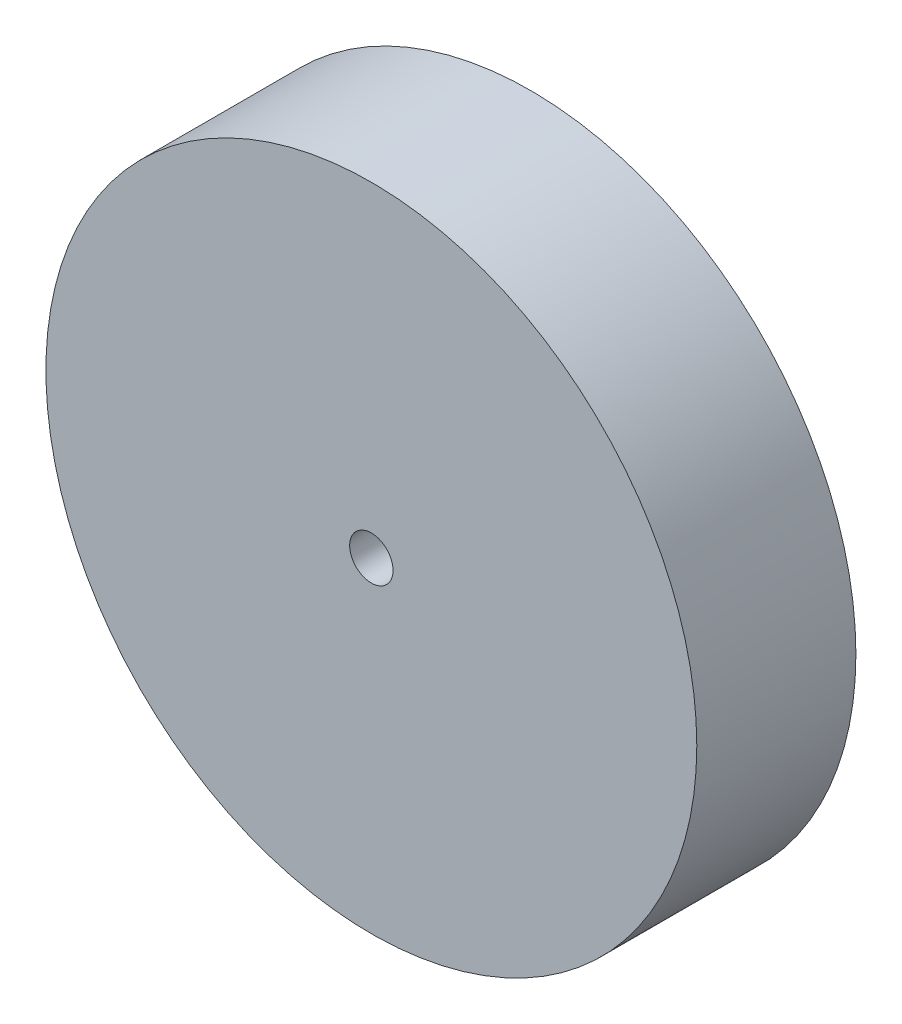
ISO-10303-21;
HEADER;
FILE_DESCRIPTION(('STEP AP214'),'2;1');
FILE_NAME('part.step','',(''),(''),'','','');
FILE_SCHEMA(('AUTOMOTIVE_DESIGN { 1 0 10303 214 1 1 1 1 }'));
ENDSEC;
DATA;
#1=APPLICATION_CONTEXT('core data for automotive mechanical design processes');
#2=APPLICATION_PROTOCOL_DEFINITION('international standard','automotive_design',2000,#1);
#3=PRODUCT_CONTEXT('',#1,'mechanical');
#4=PRODUCT('Part','Part','',(#3));
#5=PRODUCT_RELATED_PRODUCT_CATEGORY('part','',(#4));
#6=PRODUCT_DEFINITION_FORMATION('','',#4);
#7=PRODUCT_DEFINITION_CONTEXT('part definition',#1,'design');
#8=PRODUCT_DEFINITION('design','',#6,#7);
#9=PRODUCT_DEFINITION_SHAPE('','',#8);
#10=(LENGTH_UNIT() NAMED_UNIT(*) SI_UNIT(.MILLI.,.METRE.));
#11=(NAMED_UNIT(*) PLANE_ANGLE_UNIT() SI_UNIT($,.RADIAN.));
#12=(NAMED_UNIT(*) SI_UNIT($,.STERADIAN.) SOLID_ANGLE_UNIT());
#13=UNCERTAINTY_MEASURE_WITH_UNIT(LENGTH_MEASURE(1.E-05),#10,'distance_accuracy_value','');
#14=(GEOMETRIC_REPRESENTATION_CONTEXT(3) GLOBAL_UNCERTAINTY_ASSIGNED_CONTEXT((#13)) GLOBAL_UNIT_ASSIGNED_CONTEXT((#10,
#11,#12)) REPRESENTATION_CONTEXT('',''));
#15=CARTESIAN_POINT('',(0.,0.,0.));
#16=DIRECTION('',(0.,0.,1.));
#17=DIRECTION('',(1.,0.,0.));
#18=AXIS2_PLACEMENT_3D('',#15,#16,#17);
#19=CARTESIAN_POINT('',(0.,0.,11.));
#20=DIRECTION('',(0.,0.,-1.));
#21=DIRECTION('',(-1.,0.,0.));
#22=AXIS2_PLACEMENT_3D('',#19,#20,#21);
#23=CYLINDRICAL_SURFACE('',#22,22.5);
#24=CARTESIAN_POINT('',(0.,0.,11.));
#25=DIRECTION('',(0.,0.,1.));
#26=DIRECTION('',(1.,0.,0.));
#27=AXIS2_PLACEMENT_3D('',#24,#25,#26);
#28=CIRCLE('',#27,22.5);
#29=CARTESIAN_POINT('',(22.5,0.,11.));
#30=VERTEX_POINT('',#29);
#31=EDGE_CURVE('E10',#30,#30,#28,.T.);
#32=ORIENTED_EDGE('',*,*,#31,.F.);
#33=EDGE_LOOP('',(#32));
#34=FACE_BOUND('',#33,.T.);
#35=CARTESIAN_POINT('',(0.,0.,0.));
#36=DIRECTION('',(0.,0.,1.));
#37=DIRECTION('',(1.,0.,0.));
#38=AXIS2_PLACEMENT_3D('',#35,#36,#37);
#39=CIRCLE('',#38,22.5);
#40=CARTESIAN_POINT('',(22.5,0.,0.));
#41=VERTEX_POINT('',#40);
#42=EDGE_CURVE('E40',#41,#41,#39,.T.);
#43=ORIENTED_EDGE('',*,*,#42,.T.);
#44=EDGE_LOOP('',(#43));
#45=FACE_BOUND('',#44,.T.);
#46=ADVANCED_FACE('F37',(#34,#45),#23,.T.);
#47=CARTESIAN_POINT('',(0.,0.,11.));
#48=DIRECTION('',(0.,0.,1.));
#49=DIRECTION('',(1.,0.,0.));
#50=AXIS2_PLACEMENT_3D('',#47,#48,#49);
#51=PLANE('',#50);
#52=CARTESIAN_POINT('',(0.,0.,11.));
#53=DIRECTION('',(0.,0.,1.));
#54=DIRECTION('',(1.,0.,0.));
#55=AXIS2_PLACEMENT_3D('',#52,#53,#54);
#56=CIRCLE('',#55,1.5);
#57=CARTESIAN_POINT('',(1.5,0.,11.));
#58=VERTEX_POINT('',#57);
#59=EDGE_CURVE('E49',#58,#58,#56,.T.);
#60=ORIENTED_EDGE('',*,*,#59,.F.);
#61=EDGE_LOOP('',(#60));
#62=FACE_BOUND('',#61,.T.);
#63=ORIENTED_EDGE('',*,*,#31,.T.);
#64=EDGE_LOOP('',(#63));
#65=FACE_BOUND('',#64,.T.);
#66=ADVANCED_FACE('F64',(#62,#65),#51,.T.);
#67=CARTESIAN_POINT('',(0.,0.,0.));
#68=DIRECTION('',(0.,0.,1.));
#69=DIRECTION('',(1.,0.,0.));
#70=AXIS2_PLACEMENT_3D('',#67,#68,#69);
#71=PLANE('',#70);
#72=CARTESIAN_POINT('',(0.,0.,0.));
#73=DIRECTION('',(0.,0.,1.));
#74=DIRECTION('',(1.,0.,0.));
#75=AXIS2_PLACEMENT_3D('',#72,#73,#74);
#76=CIRCLE('',#75,1.5);
#77=CARTESIAN_POINT('',(1.5,0.,0.));
#78=VERTEX_POINT('',#77);
#79=EDGE_CURVE('E47',#78,#78,#76,.T.);
#80=ORIENTED_EDGE('',*,*,#79,.T.);
#81=EDGE_LOOP('',(#80));
#82=FACE_BOUND('',#81,.T.);
#83=ORIENTED_EDGE('',*,*,#42,.F.);
#84=EDGE_LOOP('',(#83));
#85=FACE_BOUND('',#84,.T.);
#86=ADVANCED_FACE('F55',(#82,#85),#71,.F.);
#87=CARTESIAN_POINT('',(0.,0.,0.));
#88=DIRECTION('',(0.,0.,1.));
#89=DIRECTION('',(1.,0.,0.));
#90=AXIS2_PLACEMENT_3D('',#87,#88,#89);
#91=CYLINDRICAL_SURFACE('',#90,1.5);
#92=ORIENTED_EDGE('',*,*,#79,.F.);
#93=EDGE_LOOP('',(#92));
#94=FACE_BOUND('',#93,.T.);
#95=ORIENTED_EDGE('',*,*,#59,.T.);
#96=EDGE_LOOP('',(#95));
#97=FACE_BOUND('',#96,.T.);
#98=ADVANCED_FACE('F58',(#94,#97),#91,.F.);
#99=CLOSED_SHELL('',(#46,#66,#86,#98));
#100=MANIFOLD_SOLID_BREP('B2',#99);
#101=ADVANCED_BREP_SHAPE_REPRESENTATION('',(#18,#100),#14);
#102=SHAPE_DEFINITION_REPRESENTATION(#9,#101);
ENDSEC;
END-ISO-10303-21;
